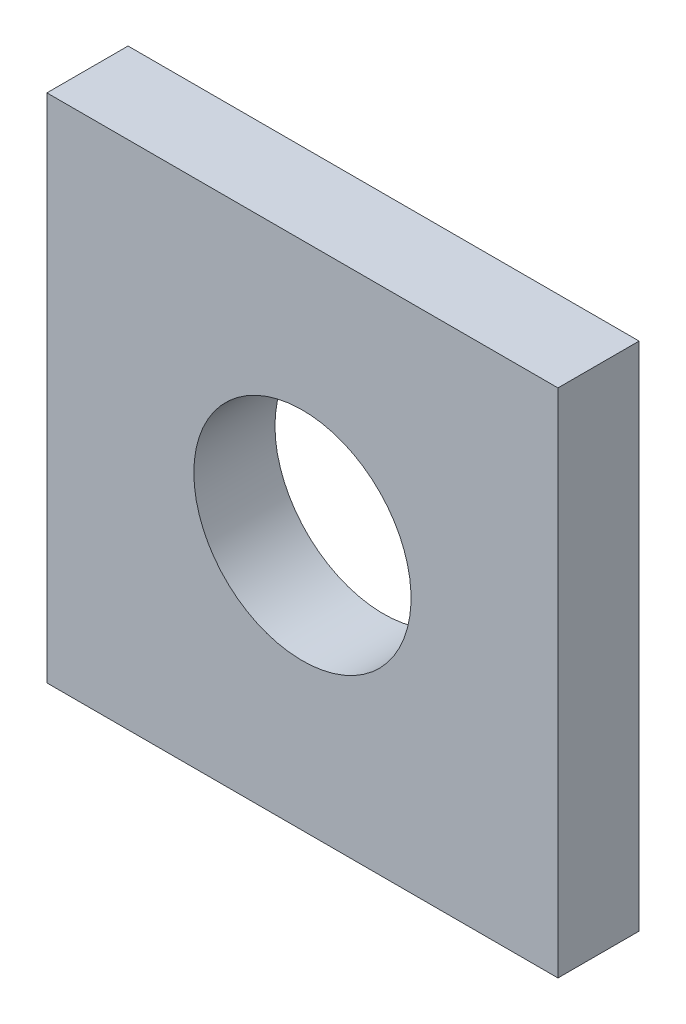
ISO-10303-21;
HEADER;
FILE_DESCRIPTION(('STEP AP214'),'2;1');
FILE_NAME('part.step','',(''),(''),'','','');
FILE_SCHEMA(('AUTOMOTIVE_DESIGN { 1 0 10303 214 1 1 1 1 }'));
ENDSEC;
DATA;
#1=APPLICATION_CONTEXT('core data for automotive mechanical design processes');
#2=APPLICATION_PROTOCOL_DEFINITION('international standard','automotive_design',2000,#1);
#3=PRODUCT_CONTEXT('',#1,'mechanical');
#4=PRODUCT('Part','Part','',(#3));
#5=PRODUCT_RELATED_PRODUCT_CATEGORY('part','',(#4));
#6=PRODUCT_DEFINITION_FORMATION('','',#4);
#7=PRODUCT_DEFINITION_CONTEXT('part definition',#1,'design');
#8=PRODUCT_DEFINITION('design','',#6,#7);
#9=PRODUCT_DEFINITION_SHAPE('','',#8);
#10=(LENGTH_UNIT() NAMED_UNIT(*) SI_UNIT(.MILLI.,.METRE.));
#11=(NAMED_UNIT(*) PLANE_ANGLE_UNIT() SI_UNIT($,.RADIAN.));
#12=(NAMED_UNIT(*) SI_UNIT($,.STERADIAN.) SOLID_ANGLE_UNIT());
#13=UNCERTAINTY_MEASURE_WITH_UNIT(LENGTH_MEASURE(1.E-05),#10,'distance_accuracy_value','');
#14=(GEOMETRIC_REPRESENTATION_CONTEXT(3) GLOBAL_UNCERTAINTY_ASSIGNED_CONTEXT((#13)) GLOBAL_UNIT_ASSIGNED_CONTEXT((#10,
#11,#12)) REPRESENTATION_CONTEXT('',''));
#15=CARTESIAN_POINT('',(0.,0.,0.));
#16=DIRECTION('',(0.,0.,1.));
#17=DIRECTION('',(1.,0.,0.));
#18=AXIS2_PLACEMENT_3D('',#15,#16,#17);
#19=CARTESIAN_POINT('',(0.,0.,3.175));
#20=DIRECTION('',(1.,0.,0.));
#21=DIRECTION('',(0.,0.,-1.));
#22=AXIS2_PLACEMENT_3D('',#19,#20,#21);
#23=PLANE('',#22);
#24=DIRECTION('',(0.,-1.,0.));
#25=VECTOR('',#24,1.);
#26=CARTESIAN_POINT('',(0.,0.,0.));
#27=LINE('',#26,#25);
#28=CARTESIAN_POINT('',(0.,20.,0.));
#29=VERTEX_POINT('',#28);
#30=CARTESIAN_POINT('',(0.,0.,0.));
#31=VERTEX_POINT('',#30);
#32=EDGE_CURVE('E95',#29,#31,#27,.T.);
#33=ORIENTED_EDGE('',*,*,#32,.T.);
#34=DIRECTION('',(0.,0.,-1.));
#35=VECTOR('',#34,1.);
#36=CARTESIAN_POINT('',(0.,0.,3.175));
#37=LINE('',#36,#35);
#38=CARTESIAN_POINT('',(0.,0.,3.175));
#39=VERTEX_POINT('',#38);
#40=EDGE_CURVE('E11',#39,#31,#37,.T.);
#41=ORIENTED_EDGE('',*,*,#40,.F.);
#42=DIRECTION('',(0.,-1.,0.));
#43=VECTOR('',#42,1.);
#44=CARTESIAN_POINT('',(0.,0.,3.175));
#45=LINE('',#44,#43);
#46=CARTESIAN_POINT('',(0.,20.,3.175));
#47=VERTEX_POINT('',#46);
#48=EDGE_CURVE('E83',#47,#39,#45,.T.);
#49=ORIENTED_EDGE('',*,*,#48,.F.);
#50=DIRECTION('',(0.,0.,-1.));
#51=VECTOR('',#50,1.);
#52=CARTESIAN_POINT('',(0.,20.,3.175));
#53=LINE('',#52,#51);
#54=EDGE_CURVE('E91',#47,#29,#53,.T.);
#55=ORIENTED_EDGE('',*,*,#54,.T.);
#56=EDGE_LOOP('',(#33,#41,#49,#55));
#57=FACE_BOUND('',#56,.T.);
#58=ADVANCED_FACE('F32',(#57),#23,.F.);
#59=CARTESIAN_POINT('',(0.,0.,3.175));
#60=DIRECTION('',(0.,1.,0.));
#61=DIRECTION('',(0.,0.,1.));
#62=AXIS2_PLACEMENT_3D('',#59,#60,#61);
#63=PLANE('',#62);
#64=DIRECTION('',(1.,0.,0.));
#65=VECTOR('',#64,1.);
#66=CARTESIAN_POINT('',(0.,0.,0.));
#67=LINE('',#66,#65);
#68=CARTESIAN_POINT('',(20.,0.,0.));
#69=VERTEX_POINT('',#68);
#70=EDGE_CURVE('E87',#31,#69,#67,.T.);
#71=ORIENTED_EDGE('',*,*,#70,.T.);
#72=DIRECTION('',(0.,0.,-1.));
#73=VECTOR('',#72,1.);
#74=CARTESIAN_POINT('',(20.,0.,3.175));
#75=LINE('',#74,#73);
#76=CARTESIAN_POINT('',(20.,0.,3.175));
#77=VERTEX_POINT('',#76);
#78=EDGE_CURVE('E40',#77,#69,#75,.T.);
#79=ORIENTED_EDGE('',*,*,#78,.F.);
#80=DIRECTION('',(1.,0.,0.));
#81=VECTOR('',#80,1.);
#82=CARTESIAN_POINT('',(0.,0.,3.175));
#83=LINE('',#82,#81);
#84=EDGE_CURVE('E78',#39,#77,#83,.T.);
#85=ORIENTED_EDGE('',*,*,#84,.F.);
#86=ORIENTED_EDGE('',*,*,#40,.T.);
#87=EDGE_LOOP('',(#71,#79,#85,#86));
#88=FACE_BOUND('',#87,.T.);
#89=ADVANCED_FACE('F86',(#88),#63,.F.);
#90=CARTESIAN_POINT('',(20.,0.,3.175));
#91=DIRECTION('',(-1.,0.,0.));
#92=DIRECTION('',(0.,0.,1.));
#93=AXIS2_PLACEMENT_3D('',#90,#91,#92);
#94=PLANE('',#93);
#95=DIRECTION('',(0.,1.,0.));
#96=VECTOR('',#95,1.);
#97=CARTESIAN_POINT('',(20.,0.,0.));
#98=LINE('',#97,#96);
#99=CARTESIAN_POINT('',(20.,20.,0.));
#100=VERTEX_POINT('',#99);
#101=EDGE_CURVE('E65',#69,#100,#98,.T.);
#102=ORIENTED_EDGE('',*,*,#101,.T.);
#103=DIRECTION('',(0.,0.,-1.));
#104=VECTOR('',#103,1.);
#105=CARTESIAN_POINT('',(20.,20.,3.175));
#106=LINE('',#105,#104);
#107=CARTESIAN_POINT('',(20.,20.,3.175));
#108=VERTEX_POINT('',#107);
#109=EDGE_CURVE('E88',#108,#100,#106,.T.);
#110=ORIENTED_EDGE('',*,*,#109,.F.);
#111=DIRECTION('',(0.,1.,0.));
#112=VECTOR('',#111,1.);
#113=CARTESIAN_POINT('',(20.,0.,3.175));
#114=LINE('',#113,#112);
#115=EDGE_CURVE('E81',#77,#108,#114,.T.);
#116=ORIENTED_EDGE('',*,*,#115,.F.);
#117=ORIENTED_EDGE('',*,*,#78,.T.);
#118=EDGE_LOOP('',(#102,#110,#116,#117));
#119=FACE_BOUND('',#118,.T.);
#120=ADVANCED_FACE('F89',(#119),#94,.F.);
#121=CARTESIAN_POINT('',(0.,20.,3.175));
#122=DIRECTION('',(0.,-1.,0.));
#123=DIRECTION('',(0.,0.,-1.));
#124=AXIS2_PLACEMENT_3D('',#121,#122,#123);
#125=PLANE('',#124);
#126=DIRECTION('',(-1.,0.,0.));
#127=VECTOR('',#126,1.);
#128=CARTESIAN_POINT('',(0.,20.,0.));
#129=LINE('',#128,#127);
#130=EDGE_CURVE('E71',#100,#29,#129,.T.);
#131=ORIENTED_EDGE('',*,*,#130,.T.);
#132=ORIENTED_EDGE('',*,*,#54,.F.);
#133=DIRECTION('',(-1.,0.,0.));
#134=VECTOR('',#133,1.);
#135=CARTESIAN_POINT('',(0.,20.,3.175));
#136=LINE('',#135,#134);
#137=EDGE_CURVE('E48',#108,#47,#136,.T.);
#138=ORIENTED_EDGE('',*,*,#137,.F.);
#139=ORIENTED_EDGE('',*,*,#109,.T.);
#140=EDGE_LOOP('',(#131,#132,#138,#139));
#141=FACE_BOUND('',#140,.T.);
#142=ADVANCED_FACE('F103',(#141),#125,.F.);
#143=CARTESIAN_POINT('',(0.,0.,3.175));
#144=DIRECTION('',(0.,0.,-1.));
#145=DIRECTION('',(-1.,0.,0.));
#146=AXIS2_PLACEMENT_3D('',#143,#144,#145);
#147=PLANE('',#146);
#148=CARTESIAN_POINT('',(10.,10.,3.175));
#149=DIRECTION('',(0.,0.,-1.));
#150=DIRECTION('',(-1.,0.,0.));
#151=AXIS2_PLACEMENT_3D('',#148,#149,#150);
#152=CIRCLE('',#151,4.25);
#153=CARTESIAN_POINT('',(5.75,10.,3.175));
#154=VERTEX_POINT('',#153);
#155=EDGE_CURVE('E98',#154,#154,#152,.T.);
#156=ORIENTED_EDGE('',*,*,#155,.T.);
#157=EDGE_LOOP('',(#156));
#158=FACE_BOUND('',#157,.T.);
#159=ORIENTED_EDGE('',*,*,#48,.T.);
#160=ORIENTED_EDGE('',*,*,#84,.T.);
#161=ORIENTED_EDGE('',*,*,#115,.T.);
#162=ORIENTED_EDGE('',*,*,#137,.T.);
#163=EDGE_LOOP('',(#159,#160,#161,#162));
#164=FACE_BOUND('',#163,.T.);
#165=ADVANCED_FACE('F79',(#158,#164),#147,.F.);
#166=CARTESIAN_POINT('',(0.,0.,0.));
#167=DIRECTION('',(0.,0.,-1.));
#168=DIRECTION('',(-1.,0.,0.));
#169=AXIS2_PLACEMENT_3D('',#166,#167,#168);
#170=PLANE('',#169);
#171=CARTESIAN_POINT('',(10.,10.,0.));
#172=DIRECTION('',(0.,0.,-1.));
#173=DIRECTION('',(-1.,0.,0.));
#174=AXIS2_PLACEMENT_3D('',#171,#172,#173);
#175=CIRCLE('',#174,4.25);
#176=CARTESIAN_POINT('',(5.75,10.,0.));
#177=VERTEX_POINT('',#176);
#178=EDGE_CURVE('E109',#177,#177,#175,.T.);
#179=ORIENTED_EDGE('',*,*,#178,.F.);
#180=EDGE_LOOP('',(#179));
#181=FACE_BOUND('',#180,.T.);
#182=ORIENTED_EDGE('',*,*,#32,.F.);
#183=ORIENTED_EDGE('',*,*,#130,.F.);
#184=ORIENTED_EDGE('',*,*,#101,.F.);
#185=ORIENTED_EDGE('',*,*,#70,.F.);
#186=EDGE_LOOP('',(#182,#183,#184,#185));
#187=FACE_BOUND('',#186,.T.);
#188=ADVANCED_FACE('F106',(#181,#187),#170,.T.);
#189=CARTESIAN_POINT('',(10.,10.,3.175));
#190=DIRECTION('',(0.,0.,-1.));
#191=DIRECTION('',(-1.,0.,0.));
#192=AXIS2_PLACEMENT_3D('',#189,#190,#191);
#193=CYLINDRICAL_SURFACE('',#192,4.25);
#194=ORIENTED_EDGE('',*,*,#155,.F.);
#195=EDGE_LOOP('',(#194));
#196=FACE_BOUND('',#195,.T.);
#197=ORIENTED_EDGE('',*,*,#178,.T.);
#198=EDGE_LOOP('',(#197));
#199=FACE_BOUND('',#198,.T.);
#200=ADVANCED_FACE('F116',(#196,#199),#193,.F.);
#201=CLOSED_SHELL('',(#58,#89,#120,#142,#165,#188,#200));
#202=MANIFOLD_SOLID_BREP('B2',#201);
#203=ADVANCED_BREP_SHAPE_REPRESENTATION('',(#18,#202),#14);
#204=SHAPE_DEFINITION_REPRESENTATION(#9,#203);
ENDSEC;
END-ISO-10303-21;
